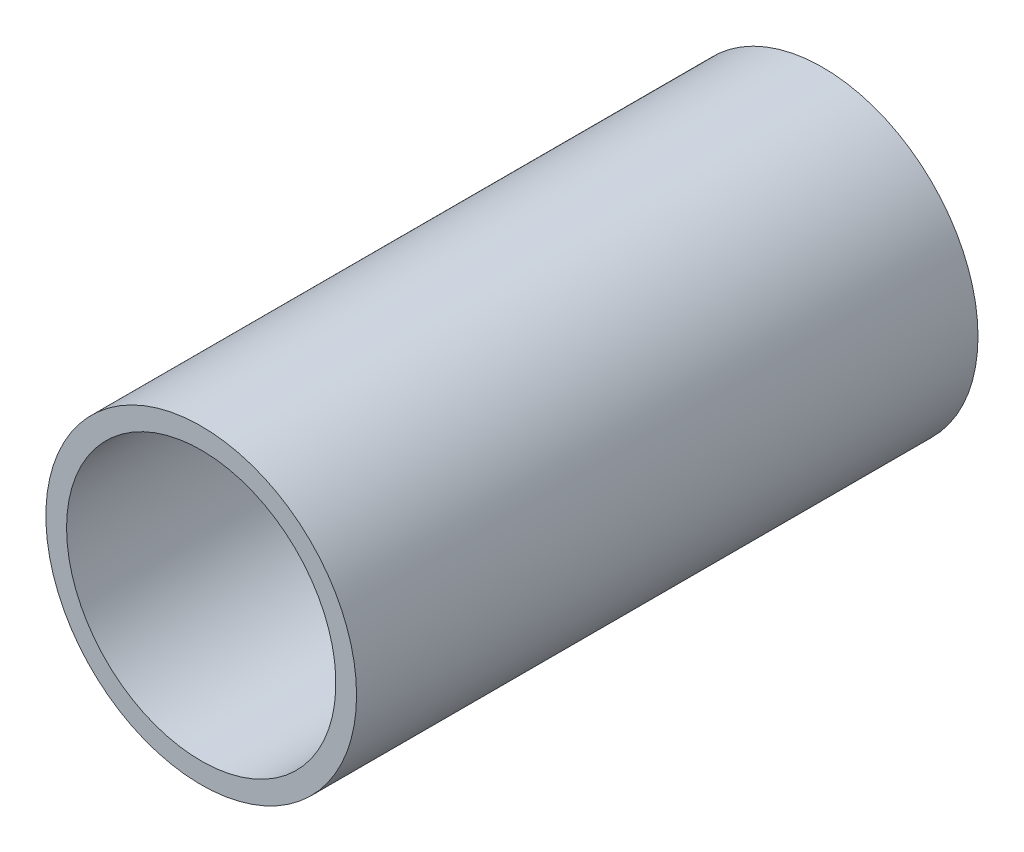
ISO-10303-21;
HEADER;
FILE_DESCRIPTION(('STEP AP214'),'2;1');
FILE_NAME('part.step','',(''),(''),'','','');
FILE_SCHEMA(('AUTOMOTIVE_DESIGN { 1 0 10303 214 1 1 1 1 }'));
ENDSEC;
DATA;
#1=APPLICATION_CONTEXT('core data for automotive mechanical design processes');
#2=APPLICATION_PROTOCOL_DEFINITION('international standard','automotive_design',2000,#1);
#3=PRODUCT_CONTEXT('',#1,'mechanical');
#4=PRODUCT('Part','Part','',(#3));
#5=PRODUCT_RELATED_PRODUCT_CATEGORY('part','',(#4));
#6=PRODUCT_DEFINITION_FORMATION('','',#4);
#7=PRODUCT_DEFINITION_CONTEXT('part definition',#1,'design');
#8=PRODUCT_DEFINITION('design','',#6,#7);
#9=PRODUCT_DEFINITION_SHAPE('','',#8);
#10=(LENGTH_UNIT() NAMED_UNIT(*) SI_UNIT(.MILLI.,.METRE.));
#11=(NAMED_UNIT(*) PLANE_ANGLE_UNIT() SI_UNIT($,.RADIAN.));
#12=(NAMED_UNIT(*) SI_UNIT($,.STERADIAN.) SOLID_ANGLE_UNIT());
#13=UNCERTAINTY_MEASURE_WITH_UNIT(LENGTH_MEASURE(1.E-05),#10,'distance_accuracy_value','');
#14=(GEOMETRIC_REPRESENTATION_CONTEXT(3) GLOBAL_UNCERTAINTY_ASSIGNED_CONTEXT((#13)) GLOBAL_UNIT_ASSIGNED_CONTEXT((#10,
#11,#12)) REPRESENTATION_CONTEXT('',''));
#15=CARTESIAN_POINT('',(0.,0.,0.));
#16=DIRECTION('',(0.,0.,1.));
#17=DIRECTION('',(1.,0.,0.));
#18=AXIS2_PLACEMENT_3D('',#15,#16,#17);
#19=CARTESIAN_POINT('',(0.,0.,60.));
#20=DIRECTION('',(0.,0.,-1.));
#21=DIRECTION('',(-1.,0.,0.));
#22=AXIS2_PLACEMENT_3D('',#19,#20,#21);
#23=CYLINDRICAL_SURFACE('',#22,15.);
#24=CARTESIAN_POINT('',(0.,0.,60.));
#25=DIRECTION('',(0.,0.,1.));
#26=DIRECTION('',(1.,0.,0.));
#27=AXIS2_PLACEMENT_3D('',#24,#25,#26);
#28=CIRCLE('',#27,15.);
#29=CARTESIAN_POINT('',(15.,0.,60.));
#30=VERTEX_POINT('',#29);
#31=EDGE_CURVE('E10',#30,#30,#28,.T.);
#32=ORIENTED_EDGE('',*,*,#31,.F.);
#33=EDGE_LOOP('',(#32));
#34=FACE_BOUND('',#33,.T.);
#35=CARTESIAN_POINT('',(0.,0.,0.));
#36=DIRECTION('',(0.,0.,1.));
#37=DIRECTION('',(1.,0.,0.));
#38=AXIS2_PLACEMENT_3D('',#35,#36,#37);
#39=CIRCLE('',#38,15.);
#40=CARTESIAN_POINT('',(15.,0.,0.));
#41=VERTEX_POINT('',#40);
#42=EDGE_CURVE('E38',#41,#41,#39,.T.);
#43=ORIENTED_EDGE('',*,*,#42,.T.);
#44=EDGE_LOOP('',(#43));
#45=FACE_BOUND('',#44,.T.);
#46=ADVANCED_FACE('F35',(#34,#45),#23,.T.);
#47=CARTESIAN_POINT('',(0.,0.,60.));
#48=DIRECTION('',(0.,0.,1.));
#49=DIRECTION('',(1.,0.,0.));
#50=AXIS2_PLACEMENT_3D('',#47,#48,#49);
#51=PLANE('',#50);
#52=CARTESIAN_POINT('',(0.,0.,60.));
#53=DIRECTION('',(0.,0.,-1.));
#54=DIRECTION('',(-1.,0.,0.));
#55=AXIS2_PLACEMENT_3D('',#52,#53,#54);
#56=CIRCLE('',#55,13.);
#57=CARTESIAN_POINT('',(-13.,0.,60.));
#58=VERTEX_POINT('',#57);
#59=EDGE_CURVE('E45',#58,#58,#56,.T.);
#60=ORIENTED_EDGE('',*,*,#59,.T.);
#61=EDGE_LOOP('',(#60));
#62=FACE_BOUND('',#61,.T.);
#63=ORIENTED_EDGE('',*,*,#31,.T.);
#64=EDGE_LOOP('',(#63));
#65=FACE_BOUND('',#64,.T.);
#66=ADVANCED_FACE('F53',(#62,#65),#51,.T.);
#67=CARTESIAN_POINT('',(0.,0.,0.));
#68=DIRECTION('',(0.,0.,1.));
#69=DIRECTION('',(1.,0.,0.));
#70=AXIS2_PLACEMENT_3D('',#67,#68,#69);
#71=PLANE('',#70);
#72=CARTESIAN_POINT('',(0.,0.,0.));
#73=DIRECTION('',(0.,0.,-1.));
#74=DIRECTION('',(-1.,0.,0.));
#75=AXIS2_PLACEMENT_3D('',#72,#73,#74);
#76=CIRCLE('',#75,13.);
#77=CARTESIAN_POINT('',(-13.,0.,0.));
#78=VERTEX_POINT('',#77);
#79=EDGE_CURVE('E47',#78,#78,#76,.T.);
#80=ORIENTED_EDGE('',*,*,#79,.F.);
#81=EDGE_LOOP('',(#80));
#82=FACE_BOUND('',#81,.T.);
#83=ORIENTED_EDGE('',*,*,#42,.F.);
#84=EDGE_LOOP('',(#83));
#85=FACE_BOUND('',#84,.T.);
#86=ADVANCED_FACE('F58',(#82,#85),#71,.F.);
#87=CARTESIAN_POINT('',(0.,0.,60.));
#88=DIRECTION('',(0.,0.,-1.));
#89=DIRECTION('',(-1.,0.,0.));
#90=AXIS2_PLACEMENT_3D('',#87,#88,#89);
#91=CYLINDRICAL_SURFACE('',#90,13.);
#92=ORIENTED_EDGE('',*,*,#59,.F.);
#93=EDGE_LOOP('',(#92));
#94=FACE_BOUND('',#93,.T.);
#95=ORIENTED_EDGE('',*,*,#79,.T.);
#96=EDGE_LOOP('',(#95));
#97=FACE_BOUND('',#96,.T.);
#98=ADVANCED_FACE('F55',(#94,#97),#91,.F.);
#99=CLOSED_SHELL('',(#46,#66,#86,#98));
#100=MANIFOLD_SOLID_BREP('B2',#99);
#101=ADVANCED_BREP_SHAPE_REPRESENTATION('',(#18,#100),#14);
#102=SHAPE_DEFINITION_REPRESENTATION(#9,#101);
ENDSEC;
END-ISO-10303-21;
